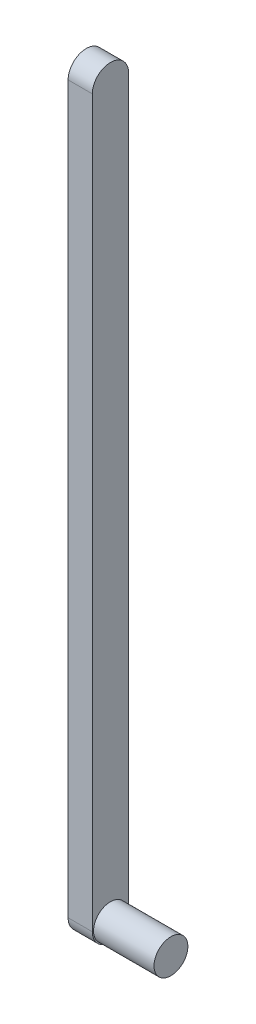
ISO-10303-21;
HEADER;
FILE_DESCRIPTION(('STEP AP214'),'2;1');
FILE_NAME('part.step','',(''),(''),'','','');
FILE_SCHEMA(('AUTOMOTIVE_DESIGN { 1 0 10303 214 1 1 1 1 }'));
ENDSEC;
DATA;
#1=APPLICATION_CONTEXT('core data for automotive mechanical design processes');
#2=APPLICATION_PROTOCOL_DEFINITION('international standard','automotive_design',2000,#1);
#3=PRODUCT_CONTEXT('',#1,'mechanical');
#4=PRODUCT('Part','Part','',(#3));
#5=PRODUCT_RELATED_PRODUCT_CATEGORY('part','',(#4));
#6=PRODUCT_DEFINITION_FORMATION('','',#4);
#7=PRODUCT_DEFINITION_CONTEXT('part definition',#1,'design');
#8=PRODUCT_DEFINITION('design','',#6,#7);
#9=PRODUCT_DEFINITION_SHAPE('','',#8);
#10=(LENGTH_UNIT() NAMED_UNIT(*) SI_UNIT(.MILLI.,.METRE.));
#11=(NAMED_UNIT(*) PLANE_ANGLE_UNIT() SI_UNIT($,.RADIAN.));
#12=(NAMED_UNIT(*) SI_UNIT($,.STERADIAN.) SOLID_ANGLE_UNIT());
#13=UNCERTAINTY_MEASURE_WITH_UNIT(LENGTH_MEASURE(1.E-05),#10,'distance_accuracy_value','');
#14=(GEOMETRIC_REPRESENTATION_CONTEXT(3) GLOBAL_UNCERTAINTY_ASSIGNED_CONTEXT((#13)) GLOBAL_UNIT_ASSIGNED_CONTEXT((#10,
#11,#12)) REPRESENTATION_CONTEXT('',''));
#15=CARTESIAN_POINT('',(0.,0.,0.));
#16=DIRECTION('',(0.,0.,1.));
#17=DIRECTION('',(1.,0.,0.));
#18=AXIS2_PLACEMENT_3D('',#15,#16,#17);
#19=CARTESIAN_POINT('',(2.,0.,-1.5));
#20=DIRECTION('',(0.,0.,1.));
#21=DIRECTION('',(1.,0.,0.));
#22=AXIS2_PLACEMENT_3D('',#19,#20,#21);
#23=PLANE('',#22);
#24=DIRECTION('',(0.,1.,0.));
#25=VECTOR('',#24,1.);
#26=CARTESIAN_POINT('',(0.,0.,-1.5));
#27=LINE('',#26,#25);
#28=CARTESIAN_POINT('',(0.,0.,-1.5));
#29=VERTEX_POINT('',#28);
#30=CARTESIAN_POINT('',(0.,60.,-1.5));
#31=VERTEX_POINT('',#30);
#32=EDGE_CURVE('E97',#29,#31,#27,.T.);
#33=ORIENTED_EDGE('',*,*,#32,.T.);
#34=DIRECTION('',(-1.,0.,0.));
#35=VECTOR('',#34,1.);
#36=CARTESIAN_POINT('',(2.,60.,-1.5));
#37=LINE('',#36,#35);
#38=CARTESIAN_POINT('',(2.,60.,-1.5));
#39=VERTEX_POINT('',#38);
#40=EDGE_CURVE('E11',#39,#31,#37,.T.);
#41=ORIENTED_EDGE('',*,*,#40,.F.);
#42=DIRECTION('',(0.,1.,0.));
#43=VECTOR('',#42,1.);
#44=CARTESIAN_POINT('',(2.,0.,-1.5));
#45=LINE('',#44,#43);
#46=CARTESIAN_POINT('',(2.,0.,-1.5));
#47=VERTEX_POINT('',#46);
#48=EDGE_CURVE('E82',#47,#39,#45,.T.);
#49=ORIENTED_EDGE('',*,*,#48,.F.);
#50=DIRECTION('',(-1.,0.,0.));
#51=VECTOR('',#50,1.);
#52=CARTESIAN_POINT('',(2.,0.,-1.5));
#53=LINE('',#52,#51);
#54=EDGE_CURVE('E93',#47,#29,#53,.T.);
#55=ORIENTED_EDGE('',*,*,#54,.T.);
#56=EDGE_LOOP('',(#33,#41,#49,#55));
#57=FACE_BOUND('',#56,.T.);
#58=ADVANCED_FACE('F35',(#57),#23,.F.);
#59=CARTESIAN_POINT('',(2.,60.,0.));
#60=DIRECTION('',(-1.,0.,0.));
#61=DIRECTION('',(0.,0.,1.));
#62=AXIS2_PLACEMENT_3D('',#59,#60,#61);
#63=CYLINDRICAL_SURFACE('',#62,1.5);
#64=CARTESIAN_POINT('',(0.,60.,0.));
#65=DIRECTION('',(1.,0.,0.));
#66=DIRECTION('',(0.,0.,-1.));
#67=AXIS2_PLACEMENT_3D('',#64,#65,#66);
#68=CIRCLE('',#67,1.5);
#69=CARTESIAN_POINT('',(0.,60.,1.5));
#70=VERTEX_POINT('',#69);
#71=EDGE_CURVE('E87',#31,#70,#68,.T.);
#72=ORIENTED_EDGE('',*,*,#71,.T.);
#73=DIRECTION('',(-1.,0.,0.));
#74=VECTOR('',#73,1.);
#75=CARTESIAN_POINT('',(2.,60.,1.5));
#76=LINE('',#75,#74);
#77=CARTESIAN_POINT('',(2.,60.,1.5));
#78=VERTEX_POINT('',#77);
#79=EDGE_CURVE('E43',#78,#70,#76,.T.);
#80=ORIENTED_EDGE('',*,*,#79,.F.);
#81=CARTESIAN_POINT('',(2.,60.,0.));
#82=DIRECTION('',(1.,0.,0.));
#83=DIRECTION('',(0.,0.,-1.));
#84=AXIS2_PLACEMENT_3D('',#81,#82,#83);
#85=CIRCLE('',#84,1.5);
#86=EDGE_CURVE('E77',#39,#78,#85,.T.);
#87=ORIENTED_EDGE('',*,*,#86,.F.);
#88=ORIENTED_EDGE('',*,*,#40,.T.);
#89=EDGE_LOOP('',(#72,#80,#87,#88));
#90=FACE_BOUND('',#89,.T.);
#91=ADVANCED_FACE('F86',(#90),#63,.T.);
#92=CARTESIAN_POINT('',(2.,0.,1.5));
#93=DIRECTION('',(0.,0.,1.));
#94=DIRECTION('',(1.,0.,0.));
#95=AXIS2_PLACEMENT_3D('',#92,#93,#94);
#96=PLANE('',#95);
#97=DIRECTION('',(0.,1.,0.));
#98=VECTOR('',#97,1.);
#99=CARTESIAN_POINT('',(0.,0.,1.5));
#100=LINE('',#99,#98);
#101=CARTESIAN_POINT('',(0.,0.,1.5));
#102=VERTEX_POINT('',#101);
#103=EDGE_CURVE('E102',#102,#70,#100,.T.);
#104=ORIENTED_EDGE('',*,*,#103,.F.);
#105=DIRECTION('',(-1.,0.,0.));
#106=VECTOR('',#105,1.);
#107=CARTESIAN_POINT('',(2.,0.,1.5));
#108=LINE('',#107,#106);
#109=CARTESIAN_POINT('',(2.,0.,1.5));
#110=VERTEX_POINT('',#109);
#111=EDGE_CURVE('E67',#110,#102,#108,.T.);
#112=ORIENTED_EDGE('',*,*,#111,.F.);
#113=DIRECTION('',(0.,1.,0.));
#114=VECTOR('',#113,1.);
#115=CARTESIAN_POINT('',(2.,0.,1.5));
#116=LINE('',#115,#114);
#117=EDGE_CURVE('E80',#110,#78,#116,.T.);
#118=ORIENTED_EDGE('',*,*,#117,.T.);
#119=ORIENTED_EDGE('',*,*,#79,.T.);
#120=EDGE_LOOP('',(#104,#112,#118,#119));
#121=FACE_BOUND('',#120,.T.);
#122=ADVANCED_FACE('F91',(#121),#96,.T.);
#123=CARTESIAN_POINT('',(2.,0.,0.));
#124=DIRECTION('',(-1.,0.,0.));
#125=DIRECTION('',(0.,0.,1.));
#126=AXIS2_PLACEMENT_3D('',#123,#124,#125);
#127=CYLINDRICAL_SURFACE('',#126,1.5);
#128=CARTESIAN_POINT('',(0.,0.,0.));
#129=DIRECTION('',(1.,0.,0.));
#130=DIRECTION('',(0.,0.,-1.));
#131=AXIS2_PLACEMENT_3D('',#128,#129,#130);
#132=CIRCLE('',#131,1.5);
#133=EDGE_CURVE('E70',#102,#29,#132,.T.);
#134=ORIENTED_EDGE('',*,*,#133,.T.);
#135=ORIENTED_EDGE('',*,*,#54,.F.);
#136=CARTESIAN_POINT('',(2.,0.,0.));
#137=DIRECTION('',(1.,0.,0.));
#138=DIRECTION('',(0.,0.,-1.));
#139=AXIS2_PLACEMENT_3D('',#136,#137,#138);
#140=CIRCLE('',#139,1.5);
#141=EDGE_CURVE('E51',#110,#47,#140,.T.);
#142=ORIENTED_EDGE('',*,*,#141,.F.);
#143=ORIENTED_EDGE('',*,*,#111,.T.);
#144=EDGE_LOOP('',(#134,#135,#142,#143));
#145=FACE_BOUND('',#144,.T.);
#146=ADVANCED_FACE('F120',(#145),#127,.T.);
#147=CARTESIAN_POINT('',(2.,0.,0.));
#148=DIRECTION('',(1.,0.,0.));
#149=DIRECTION('',(0.,0.,-1.));
#150=AXIS2_PLACEMENT_3D('',#147,#148,#149);
#151=PLANE('',#150);
#152=CARTESIAN_POINT('',(2.,0.,0.));
#153=DIRECTION('',(1.,0.,0.));
#154=DIRECTION('',(0.,0.,-1.));
#155=AXIS2_PLACEMENT_3D('',#152,#153,#154);
#156=CIRCLE('',#155,1.4);
#157=CARTESIAN_POINT('',(2.,0.,-1.4));
#158=VERTEX_POINT('',#157);
#159=EDGE_CURVE('E166',#158,#158,#156,.T.);
#160=ORIENTED_EDGE('',*,*,#159,.F.);
#161=EDGE_LOOP('',(#160));
#162=FACE_BOUND('',#161,.T.);
#163=ORIENTED_EDGE('',*,*,#48,.T.);
#164=ORIENTED_EDGE('',*,*,#86,.T.);
#165=ORIENTED_EDGE('',*,*,#117,.F.);
#166=ORIENTED_EDGE('',*,*,#141,.T.);
#167=EDGE_LOOP('',(#163,#164,#165,#166));
#168=FACE_BOUND('',#167,.T.);
#169=ADVANCED_FACE('F78',(#162,#168),#151,.T.);
#170=CARTESIAN_POINT('',(0.,0.,0.));
#171=DIRECTION('',(1.,0.,0.));
#172=DIRECTION('',(0.,0.,-1.));
#173=AXIS2_PLACEMENT_3D('',#170,#171,#172);
#174=PLANE('',#173);
#175=ORIENTED_EDGE('',*,*,#32,.F.);
#176=ORIENTED_EDGE('',*,*,#133,.F.);
#177=ORIENTED_EDGE('',*,*,#103,.T.);
#178=ORIENTED_EDGE('',*,*,#71,.F.);
#179=EDGE_LOOP('',(#175,#176,#177,#178));
#180=FACE_BOUND('',#179,.T.);
#181=ADVANCED_FACE('F109',(#180),#174,.F.);
#182=CARTESIAN_POINT('',(7.,0.,0.));
#183=DIRECTION('',(-1.,0.,0.));
#184=DIRECTION('',(0.,0.,1.));
#185=AXIS2_PLACEMENT_3D('',#182,#183,#184);
#186=CYLINDRICAL_SURFACE('',#185,1.4);
#187=CARTESIAN_POINT('',(7.,0.,0.));
#188=DIRECTION('',(1.,0.,0.));
#189=DIRECTION('',(0.,0.,-1.));
#190=AXIS2_PLACEMENT_3D('',#187,#188,#189);
#191=CIRCLE('',#190,1.4);
#192=CARTESIAN_POINT('',(7.,0.,-1.4));
#193=VERTEX_POINT('',#192);
#194=EDGE_CURVE('E100',#193,#193,#191,.T.);
#195=ORIENTED_EDGE('',*,*,#194,.F.);
#196=EDGE_LOOP('',(#195));
#197=FACE_BOUND('',#196,.T.);
#198=ORIENTED_EDGE('',*,*,#159,.T.);
#199=EDGE_LOOP('',(#198));
#200=FACE_BOUND('',#199,.T.);
#201=ADVANCED_FACE('F111',(#197,#200),#186,.T.);
#202=CARTESIAN_POINT('',(7.,0.,0.));
#203=DIRECTION('',(1.,0.,0.));
#204=DIRECTION('',(0.,0.,-1.));
#205=AXIS2_PLACEMENT_3D('',#202,#203,#204);
#206=PLANE('',#205);
#207=ORIENTED_EDGE('',*,*,#194,.T.);
#208=EDGE_LOOP('',(#207));
#209=FACE_BOUND('',#208,.T.);
#210=ADVANCED_FACE('F117',(#209),#206,.T.);
#211=CLOSED_SHELL('',(#58,#91,#122,#146,#169,#181,#201,#210));
#212=MANIFOLD_SOLID_BREP('B2',#211);
#213=ADVANCED_BREP_SHAPE_REPRESENTATION('',(#18,#212),#14);
#214=SHAPE_DEFINITION_REPRESENTATION(#9,#213);
ENDSEC;
END-ISO-10303-21;
